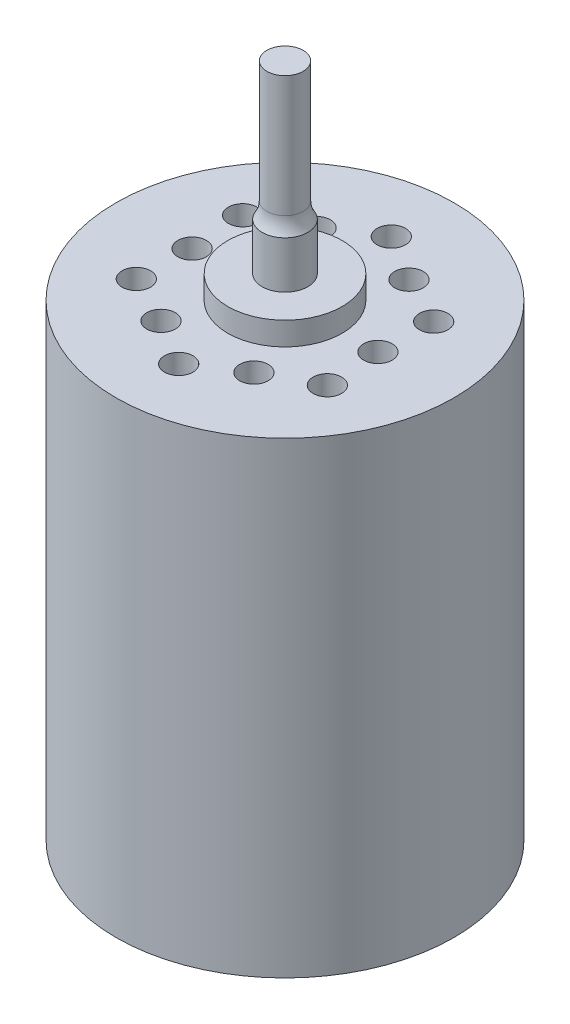
ISO-10303-21;
HEADER;
FILE_DESCRIPTION(('STEP AP214'),'2;1');
FILE_NAME('part.step','',(''),(''),'','','');
FILE_SCHEMA(('AUTOMOTIVE_DESIGN { 1 0 10303 214 1 1 1 1 }'));
ENDSEC;
DATA;
#1=APPLICATION_CONTEXT('core data for automotive mechanical design processes');
#2=APPLICATION_PROTOCOL_DEFINITION('international standard','automotive_design',2000,#1);
#3=PRODUCT_CONTEXT('',#1,'mechanical');
#4=PRODUCT('Part','Part','',(#3));
#5=PRODUCT_RELATED_PRODUCT_CATEGORY('part','',(#4));
#6=PRODUCT_DEFINITION_FORMATION('','',#4);
#7=PRODUCT_DEFINITION_CONTEXT('part definition',#1,'design');
#8=PRODUCT_DEFINITION('design','',#6,#7);
#9=PRODUCT_DEFINITION_SHAPE('','',#8);
#10=(LENGTH_UNIT() NAMED_UNIT(*) SI_UNIT(.MILLI.,.METRE.));
#11=(NAMED_UNIT(*) PLANE_ANGLE_UNIT() SI_UNIT($,.RADIAN.));
#12=(NAMED_UNIT(*) SI_UNIT($,.STERADIAN.) SOLID_ANGLE_UNIT());
#13=UNCERTAINTY_MEASURE_WITH_UNIT(LENGTH_MEASURE(1.E-05),#10,'distance_accuracy_value','');
#14=(GEOMETRIC_REPRESENTATION_CONTEXT(3) GLOBAL_UNCERTAINTY_ASSIGNED_CONTEXT((#13)) GLOBAL_UNIT_ASSIGNED_CONTEXT((#10,
#11,#12)) REPRESENTATION_CONTEXT('',''));
#15=CARTESIAN_POINT('',(0.,0.,0.));
#16=DIRECTION('',(0.,0.,1.));
#17=DIRECTION('',(1.,0.,0.));
#18=AXIS2_PLACEMENT_3D('',#15,#16,#17);
#19=CARTESIAN_POINT('',(0.,43.0276,0.));
#20=DIRECTION('',(0.,1.,0.));
#21=DIRECTION('',(0.,0.,1.));
#22=AXIS2_PLACEMENT_3D('',#19,#20,#21);
#23=PLANE('',#22);
#24=CARTESIAN_POINT('',(0.,43.0276,0.));
#25=DIRECTION('',(0.,1.,0.));
#26=DIRECTION('',(0.,0.,1.));
#27=AXIS2_PLACEMENT_3D('',#24,#25,#26);
#28=CIRCLE('',#27,5.0165);
#29=CARTESIAN_POINT('',(0.,43.0276,5.0165));
#30=VERTEX_POINT('',#29);
#31=EDGE_CURVE('E49',#30,#30,#28,.T.);
#32=ORIENTED_EDGE('',*,*,#31,.T.);
#33=EDGE_LOOP('',(#32));
#34=FACE_BOUND('',#33,.T.);
#35=CARTESIAN_POINT('',(0.,43.0276,0.));
#36=DIRECTION('',(0.,1.,0.));
#37=DIRECTION('',(0.,0.,1.));
#38=AXIS2_PLACEMENT_3D('',#35,#36,#37);
#39=CIRCLE('',#38,2.0066);
#40=CARTESIAN_POINT('',(0.,43.0276,2.0066));
#41=VERTEX_POINT('',#40);
#42=EDGE_CURVE('E57',#41,#41,#39,.T.);
#43=ORIENTED_EDGE('',*,*,#42,.F.);
#44=EDGE_LOOP('',(#43));
#45=FACE_BOUND('',#44,.T.);
#46=ADVANCED_FACE('F33',(#34,#45),#23,.T.);
#47=CARTESIAN_POINT('',(0.,40.9956,0.));
#48=DIRECTION('',(0.,1.,0.));
#49=DIRECTION('',(0.,0.,1.));
#50=AXIS2_PLACEMENT_3D('',#47,#48,#49);
#51=PLANE('',#50);
#52=CARTESIAN_POINT('',(4.1272177151194,40.9956,6.85317984092091));
#53=DIRECTION('',(0.,1.,0.));
#54=DIRECTION('',(0.,0.,1.));
#55=AXIS2_PLACEMENT_3D('',#52,#53,#54);
#56=CIRCLE('',#55,1.25);
#57=CARTESIAN_POINT('',(4.1272177151194,40.9956,8.10317984092091));
#58=VERTEX_POINT('',#57);
#59=EDGE_CURVE('E98',#58,#58,#56,.T.);
#60=ORIENTED_EDGE('',*,*,#59,.F.);
#61=EDGE_LOOP('',(#60));
#62=FACE_BOUND('',#61,.T.);
#63=CARTESIAN_POINT('',(-8.31352755408481,40.9956,-4.59731004039021));
#64=DIRECTION('',(0.,1.,0.));
#65=DIRECTION('',(0.,0.,1.));
#66=AXIS2_PLACEMENT_3D('',#63,#64,#65);
#67=CIRCLE('',#66,1.25);
#68=CARTESIAN_POINT('',(-8.31352755408481,40.9956,-3.34731004039021));
#69=VERTEX_POINT('',#68);
#70=EDGE_CURVE('E95',#69,#69,#67,.T.);
#71=ORIENTED_EDGE('',*,*,#70,.F.);
#72=EDGE_LOOP('',(#71));
#73=FACE_BOUND('',#72,.T.);
#74=CARTESIAN_POINT('',(-4.12721771511939,40.9956,-6.8531798409209));
#75=DIRECTION('',(0.,1.,0.));
#76=DIRECTION('',(0.,0.,1.));
#77=AXIS2_PLACEMENT_3D('',#74,#75,#76);
#78=CIRCLE('',#77,1.25);
#79=CARTESIAN_POINT('',(-4.12721771511939,40.9956,-5.6031798409209));
#80=VERTEX_POINT('',#79);
#81=EDGE_CURVE('E92',#80,#80,#78,.T.);
#82=ORIENTED_EDGE('',*,*,#81,.F.);
#83=EDGE_LOOP('',(#82));
#84=FACE_BOUND('',#83,.T.);
#85=CARTESIAN_POINT('',(-7.9986366965006,40.9956,0.147685467782111));
#86=DIRECTION('',(0.,1.,0.));
#87=DIRECTION('',(0.,0.,1.));
#88=AXIS2_PLACEMENT_3D('',#85,#86,#87);
#89=CIRCLE('',#88,1.25);
#90=CARTESIAN_POINT('',(-7.9986366965006,40.9956,1.39768546778211));
#91=VERTEX_POINT('',#90);
#92=EDGE_CURVE('E89',#91,#91,#89,.T.);
#93=ORIENTED_EDGE('',*,*,#92,.F.);
#94=EDGE_LOOP('',(#93));
#95=FACE_BOUND('',#94,.T.);
#96=CARTESIAN_POINT('',(-8.13815106109359,40.9956,4.90107103670425));
#97=DIRECTION('',(0.,1.,0.));
#98=DIRECTION('',(0.,0.,1.));
#99=AXIS2_PLACEMENT_3D('',#96,#97,#98);
#100=CIRCLE('',#99,1.25);
#101=CARTESIAN_POINT('',(-8.13815106109359,40.9956,6.15107103670425));
#102=VERTEX_POINT('',#101);
#103=EDGE_CURVE('E86',#102,#102,#100,.T.);
#104=ORIENTED_EDGE('',*,*,#103,.F.);
#105=EDGE_LOOP('',(#104));
#106=FACE_BOUND('',#105,.T.);
#107=CARTESIAN_POINT('',(-3.8714189813812,40.9956,7.00086530870301));
#108=DIRECTION('',(0.,1.,0.));
#109=DIRECTION('',(0.,0.,1.));
#110=AXIS2_PLACEMENT_3D('',#107,#108,#109);
#111=CIRCLE('',#110,1.25);
#112=CARTESIAN_POINT('',(-3.8714189813812,40.9956,8.25086530870301));
#113=VERTEX_POINT('',#112);
#114=EDGE_CURVE('E83',#113,#113,#111,.T.);
#115=ORIENTED_EDGE('',*,*,#114,.F.);
#116=EDGE_LOOP('',(#115));
#117=FACE_BOUND('',#116,.T.);
#118=CARTESIAN_POINT('',(0.175376492991219,40.9956,9.49838107709446));
#119=DIRECTION('',(0.,1.,0.));
#120=DIRECTION('',(0.,0.,1.));
#121=AXIS2_PLACEMENT_3D('',#118,#119,#120);
#122=CIRCLE('',#121,1.25);
#123=CARTESIAN_POINT('',(0.175376492991219,40.9956,10.7483810770945));
#124=VERTEX_POINT('',#123);
#125=EDGE_CURVE('E80',#124,#124,#122,.T.);
#126=ORIENTED_EDGE('',*,*,#125,.F.);
#127=EDGE_LOOP('',(#126));
#128=FACE_BOUND('',#127,.T.);
#129=CARTESIAN_POINT('',(8.31352755408481,40.9956,4.59731004039021));
#130=DIRECTION('',(0.,1.,0.));
#131=DIRECTION('',(0.,0.,1.));
#132=AXIS2_PLACEMENT_3D('',#129,#130,#131);
#133=CIRCLE('',#132,1.25);
#134=CARTESIAN_POINT('',(8.31352755408481,40.9956,5.84731004039021));
#135=VERTEX_POINT('',#134);
#136=EDGE_CURVE('E77',#135,#135,#133,.T.);
#137=ORIENTED_EDGE('',*,*,#136,.F.);
#138=EDGE_LOOP('',(#137));
#139=FACE_BOUND('',#138,.T.);
#140=CARTESIAN_POINT('',(7.9986366965006,40.9956,-0.147685467782108));
#141=DIRECTION('',(0.,1.,0.));
#142=DIRECTION('',(0.,0.,1.));
#143=AXIS2_PLACEMENT_3D('',#140,#141,#142);
#144=CIRCLE('',#143,1.25);
#145=CARTESIAN_POINT('',(7.9986366965006,40.9956,1.10231453221789));
#146=VERTEX_POINT('',#145);
#147=EDGE_CURVE('E74',#146,#146,#144,.T.);
#148=ORIENTED_EDGE('',*,*,#147,.F.);
#149=EDGE_LOOP('',(#148));
#150=FACE_BOUND('',#149,.T.);
#151=CARTESIAN_POINT('',(8.13815106109359,40.9956,-4.90107103670425));
#152=DIRECTION('',(0.,1.,0.));
#153=DIRECTION('',(0.,0.,1.));
#154=AXIS2_PLACEMENT_3D('',#151,#152,#153);
#155=CIRCLE('',#154,1.25);
#156=CARTESIAN_POINT('',(8.13815106109359,40.9956,-3.65107103670425));
#157=VERTEX_POINT('',#156);
#158=EDGE_CURVE('E71',#157,#157,#155,.T.);
#159=ORIENTED_EDGE('',*,*,#158,.F.);
#160=EDGE_LOOP('',(#159));
#161=FACE_BOUND('',#160,.T.);
#162=CARTESIAN_POINT('',(3.8714189813812,40.9956,-7.00086530870301));
#163=DIRECTION('',(0.,1.,0.));
#164=DIRECTION('',(0.,0.,1.));
#165=AXIS2_PLACEMENT_3D('',#162,#163,#164);
#166=CIRCLE('',#165,1.25);
#167=CARTESIAN_POINT('',(3.8714189813812,40.9956,-5.75086530870302));
#168=VERTEX_POINT('',#167);
#169=EDGE_CURVE('E68',#168,#168,#166,.T.);
#170=ORIENTED_EDGE('',*,*,#169,.F.);
#171=EDGE_LOOP('',(#170));
#172=FACE_BOUND('',#171,.T.);
#173=CARTESIAN_POINT('',(-0.175376492991219,40.9956,-9.49838107709446));
#174=DIRECTION('',(0.,1.,0.));
#175=DIRECTION('',(0.,0.,1.));
#176=AXIS2_PLACEMENT_3D('',#173,#174,#175);
#177=CIRCLE('',#176,1.25);
#178=CARTESIAN_POINT('',(-0.175376492991219,40.9956,-8.24838107709446));
#179=VERTEX_POINT('',#178);
#180=EDGE_CURVE('E65',#179,#179,#177,.T.);
#181=ORIENTED_EDGE('',*,*,#180,.F.);
#182=EDGE_LOOP('',(#181));
#183=FACE_BOUND('',#182,.T.);
#184=CARTESIAN_POINT('',(0.,40.9956,0.));
#185=DIRECTION('',(0.,1.,0.));
#186=DIRECTION('',(0.,0.,1.));
#187=AXIS2_PLACEMENT_3D('',#184,#185,#186);
#188=CIRCLE('',#187,14.8209);
#189=CARTESIAN_POINT('',(0.,40.9956,14.8209));
#190=VERTEX_POINT('',#189);
#191=EDGE_CURVE('E40',#190,#190,#188,.T.);
#192=ORIENTED_EDGE('',*,*,#191,.T.);
#193=EDGE_LOOP('',(#192));
#194=FACE_BOUND('',#193,.T.);
#195=CARTESIAN_POINT('',(0.,40.9956,0.));
#196=DIRECTION('',(0.,1.,0.));
#197=DIRECTION('',(0.,0.,1.));
#198=AXIS2_PLACEMENT_3D('',#195,#196,#197);
#199=CIRCLE('',#198,5.0165);
#200=CARTESIAN_POINT('',(0.,40.9956,5.0165));
#201=VERTEX_POINT('',#200);
#202=EDGE_CURVE('E51',#201,#201,#199,.T.);
#203=ORIENTED_EDGE('',*,*,#202,.F.);
#204=EDGE_LOOP('',(#203));
#205=FACE_BOUND('',#204,.T.);
#206=ADVANCED_FACE('F177',(#62,#73,#84,#95,#106,#117,#128,#139,#150,#161,#172,#183,#194,#205),
#51,.T.);
#207=CARTESIAN_POINT('',(0.,40.9956,0.));
#208=DIRECTION('',(0.,-1.,0.));
#209=DIRECTION('',(0.,0.,-1.));
#210=AXIS2_PLACEMENT_3D('',#207,#208,#209);
#211=CYLINDRICAL_SURFACE('',#210,14.8209);
#212=ORIENTED_EDGE('',*,*,#191,.F.);
#213=EDGE_LOOP('',(#212));
#214=FACE_BOUND('',#213,.T.);
#215=CARTESIAN_POINT('',(0.,0.,0.));
#216=DIRECTION('',(0.,1.,0.));
#217=DIRECTION('',(0.,0.,1.));
#218=AXIS2_PLACEMENT_3D('',#215,#216,#217);
#219=CIRCLE('',#218,14.8209);
#220=CARTESIAN_POINT('',(0.,0.,14.8209));
#221=VERTEX_POINT('',#220);
#222=EDGE_CURVE('E44',#221,#221,#219,.T.);
#223=ORIENTED_EDGE('',*,*,#222,.T.);
#224=EDGE_LOOP('',(#223));
#225=FACE_BOUND('',#224,.T.);
#226=ADVANCED_FACE('F179',(#214,#225),#211,.T.);
#227=CARTESIAN_POINT('',(0.,0.,0.));
#228=DIRECTION('',(0.,1.,0.));
#229=DIRECTION('',(0.,0.,1.));
#230=AXIS2_PLACEMENT_3D('',#227,#228,#229);
#231=PLANE('',#230);
#232=ORIENTED_EDGE('',*,*,#222,.F.);
#233=EDGE_LOOP('',(#232));
#234=FACE_BOUND('',#233,.T.);
#235=ADVANCED_FACE('F188',(#234),#231,.F.);
#236=CARTESIAN_POINT('',(0.,43.0276,0.));
#237=DIRECTION('',(0.,-1.,0.));
#238=DIRECTION('',(0.,0.,-1.));
#239=AXIS2_PLACEMENT_3D('',#236,#237,#238);
#240=CYLINDRICAL_SURFACE('',#239,5.0165);
#241=ORIENTED_EDGE('',*,*,#31,.F.);
#242=EDGE_LOOP('',(#241));
#243=FACE_BOUND('',#242,.T.);
#244=ORIENTED_EDGE('',*,*,#202,.T.);
#245=EDGE_LOOP('',(#244));
#246=FACE_BOUND('',#245,.T.);
#247=ADVANCED_FACE('F185',(#243,#246),#240,.T.);
#248=CARTESIAN_POINT('',(0.,47.1551,0.));
#249=DIRECTION('',(0.,-1.,0.));
#250=DIRECTION('',(0.,0.,-1.));
#251=AXIS2_PLACEMENT_3D('',#248,#249,#250);
#252=CYLINDRICAL_SURFACE('',#251,2.0066);
#253=CARTESIAN_POINT('',(0.,47.1551,0.));
#254=DIRECTION('',(0.,1.,0.));
#255=DIRECTION('',(0.,0.,1.));
#256=AXIS2_PLACEMENT_3D('',#253,#254,#255);
#257=CIRCLE('',#256,2.0066);
#258=CARTESIAN_POINT('',(0.,47.1551,2.0066));
#259=VERTEX_POINT('',#258);
#260=EDGE_CURVE('E54',#259,#259,#257,.T.);
#261=ORIENTED_EDGE('',*,*,#260,.F.);
#262=EDGE_LOOP('',(#261));
#263=FACE_BOUND('',#262,.T.);
#264=ORIENTED_EDGE('',*,*,#42,.T.);
#265=EDGE_LOOP('',(#264));
#266=FACE_BOUND('',#265,.T.);
#267=ADVANCED_FACE('F187',(#263,#266),#252,.T.);
#268=CARTESIAN_POINT('',(0.,59.182,0.));
#269=DIRECTION('',(0.,-1.,0.));
#270=DIRECTION('',(0.,0.,-1.));
#271=AXIS2_PLACEMENT_3D('',#268,#269,#270);
#272=CYLINDRICAL_SURFACE('',#271,1.59385);
#273=CARTESIAN_POINT('',(0.,48.543050805144,0.));
#274=DIRECTION('',(0.,-1.,0.));
#275=DIRECTION('',(0.,0.,-1.));
#276=AXIS2_PLACEMENT_3D('',#273,#274,#275);
#277=CIRCLE('',#276,1.59385);
#278=CARTESIAN_POINT('',(0.,48.543050805144,-1.59385));
#279=VERTEX_POINT('',#278);
#280=EDGE_CURVE('E10',#279,#279,#277,.F.);
#281=CARTESIAN_POINT('',(0.,59.182,0.));
#282=DIRECTION('',(0.,1.,0.));
#283=DIRECTION('',(0.,0.,1.));
#284=AXIS2_PLACEMENT_3D('',#281,#282,#283);
#285=CIRCLE('',#284,1.59385);
#286=CARTESIAN_POINT('',(0.,59.182,-1.59385));
#287=VERTEX_POINT('',#286);
#288=EDGE_CURVE('E60',#287,#287,#285,.T.);
#289=CARTESIAN_POINT('',(0.,48.543050805144,-1.59385));
#290=CARTESIAN_POINT('',(0.,48.6538731925905,-1.59385));
#291=CARTESIAN_POINT('',(0.,48.7646955800369,-1.59385));
#292=CARTESIAN_POINT('',(0.,48.9863403549297,-1.59385));
#293=CARTESIAN_POINT('',(0.,49.0971627423761,-1.59385));
#294=CARTESIAN_POINT('',(0.,49.318807517269,-1.59385));
#295=CARTESIAN_POINT('',(0.,49.4296299047154,-1.59385));
#296=CARTESIAN_POINT('',(0.,49.6512746796082,-1.59385));
#297=CARTESIAN_POINT('',(0.,49.7620970670546,-1.59385));
#298=CARTESIAN_POINT('',(0.,49.9837418419475,-1.59385));
#299=CARTESIAN_POINT('',(0.,50.0945642293939,-1.59385));
#300=CARTESIAN_POINT('',(0.,50.3162090042867,-1.59385));
#301=CARTESIAN_POINT('',(0.,50.4270313917331,-1.59385));
#302=CARTESIAN_POINT('',(0.,50.648676166626,-1.59385));
#303=CARTESIAN_POINT('',(0.,50.7594985540724,-1.59385));
#304=CARTESIAN_POINT('',(0.,50.9811433289652,-1.59385));
#305=CARTESIAN_POINT('',(0.,51.0919657164116,-1.59385));
#306=CARTESIAN_POINT('',(0.,51.3136104913045,-1.59385));
#307=CARTESIAN_POINT('',(0.,51.4244328787509,-1.59385));
#308=CARTESIAN_POINT('',(0.,51.6460776536437,-1.59385));
#309=CARTESIAN_POINT('',(0.,51.7569000410901,-1.59385));
#310=CARTESIAN_POINT('',(0.,51.9785448159829,-1.59385));
#311=CARTESIAN_POINT('',(0.,52.0893672034294,-1.59385));
#312=CARTESIAN_POINT('',(0.,52.3110119783222,-1.59385));
#313=CARTESIAN_POINT('',(0.,52.4218343657686,-1.59385));
#314=CARTESIAN_POINT('',(0.,52.6434791406614,-1.59385));
#315=CARTESIAN_POINT('',(0.,52.7543015281079,-1.59385));
#316=CARTESIAN_POINT('',(0.,52.9759463030007,-1.59385));
#317=CARTESIAN_POINT('',(0.,53.0867686904471,-1.59385));
#318=CARTESIAN_POINT('',(0.,53.3084134653399,-1.59385));
#319=CARTESIAN_POINT('',(0.,53.4192358527864,-1.59385));
#320=CARTESIAN_POINT('',(0.,53.6408806276792,-1.59385));
#321=CARTESIAN_POINT('',(0.,53.7517030151256,-1.59385));
#322=CARTESIAN_POINT('',(0.,53.9733477900184,-1.59385));
#323=CARTESIAN_POINT('',(0.,54.0841701774648,-1.59385));
#324=CARTESIAN_POINT('',(0.,54.3058149523577,-1.59385));
#325=CARTESIAN_POINT('',(0.,54.4166373398041,-1.59385));
#326=CARTESIAN_POINT('',(0.,54.6382821146969,-1.59385));
#327=CARTESIAN_POINT('',(0.,54.7491045021433,-1.59385));
#328=CARTESIAN_POINT('',(0.,54.9707492770362,-1.59385));
#329=CARTESIAN_POINT('',(0.,55.0815716644826,-1.59385));
#330=CARTESIAN_POINT('',(0.,55.3032164393754,-1.59385));
#331=CARTESIAN_POINT('',(0.,55.4140388268218,-1.59385));
#332=CARTESIAN_POINT('',(0.,55.6356836017147,-1.59385));
#333=CARTESIAN_POINT('',(0.,55.7465059891611,-1.59385));
#334=CARTESIAN_POINT('',(0.,55.9681507640539,-1.59385));
#335=CARTESIAN_POINT('',(0.,56.0789731515003,-1.59385));
#336=CARTESIAN_POINT('',(0.,56.3006179263932,-1.59385));
#337=CARTESIAN_POINT('',(0.,56.4114403138396,-1.59385));
#338=CARTESIAN_POINT('',(0.,56.6330850887324,-1.59385));
#339=CARTESIAN_POINT('',(0.,56.7439074761788,-1.59385));
#340=CARTESIAN_POINT('',(0.,56.9655522510717,-1.59385));
#341=CARTESIAN_POINT('',(0.,57.0763746385181,-1.59385));
#342=CARTESIAN_POINT('',(0.,57.2980194134109,-1.59385));
#343=CARTESIAN_POINT('',(0.,57.4088418008573,-1.59385));
#344=CARTESIAN_POINT('',(0.,57.6304865757502,-1.59385));
#345=CARTESIAN_POINT('',(0.,57.7413089631966,-1.59385));
#346=CARTESIAN_POINT('',(0.,57.9629537380894,-1.59385));
#347=CARTESIAN_POINT('',(0.,58.0737761255358,-1.59385));
#348=CARTESIAN_POINT('',(0.,58.2954209004287,-1.59385));
#349=CARTESIAN_POINT('',(0.,58.4062432878751,-1.59385));
#350=CARTESIAN_POINT('',(0.,58.6278880627679,-1.59385));
#351=CARTESIAN_POINT('',(0.,58.7387104502143,-1.59385));
#352=CARTESIAN_POINT('',(0.,58.9603552251072,-1.59385));
#353=CARTESIAN_POINT('',(0.,59.0711776125536,-1.59385));
#354=CARTESIAN_POINT('',(0.,59.182,-1.59385));
#355=B_SPLINE_CURVE_WITH_KNOTS('',3,(#289,#290,#291,#292,#293,#294,#295,#296,#297,#298,#299,
#300,#301,#302,#303,#304,#305,#306,#307,#308,#309,#310,#311,#312,#313,#314,#315,#316,#317,#318,
#319,#320,#321,#322,#323,#324,#325,#326,#327,#328,#329,#330,#331,#332,#333,#334,#335,#336,#337,
#338,#339,#340,#341,#342,#343,#344,#345,#346,#347,#348,#349,#350,#351,#352,#353,#354),
.UNSPECIFIED.,.F.,.F.,(4,2,2,2,2,2,2,2,2,2,2,2,2,2,2,2,2,2,2,2,2,2,2,2,2,2,2,2,2,2,2,2,4),(0.,
0.332467162339249,0.664934324678491,0.997401487017747,1.32986864935699,1.66233581169624,
1.99480297403549,2.32727013637474,2.65973729871399,2.99220446105324,3.32467162339248,
3.65713878573173,3.98960594807098,4.32207311041023,4.65454027274947,4.98700743508872,
5.31947459742797,5.65194175976722,5.98440892210647,6.31687608444572,6.64934324678497,
6.98181040912422,7.31427757146347,7.64674473380271,7.97921189614196,8.31167905848121,
8.64414622082046,8.97661338315971,9.30908054549896,9.64154770783821,9.97401487017745,
10.3064820325167,10.638949194856),.UNSPECIFIED.);
#356=EDGE_CURVE('BSEAM195',#279,#287,#355,.T.);
#357=ORIENTED_EDGE('',*,*,#280,.T.);
#358=ORIENTED_EDGE('',*,*,#288,.F.);
#359=ORIENTED_EDGE('',*,*,#356,.T.);
#360=ORIENTED_EDGE('',*,*,#356,.F.);
#361=EDGE_LOOP('',(#357,#359,#358,#360));
#362=FACE_BOUND('',#361,.T.);
#363=ADVANCED_FACE('F195',(#362),#272,.T.);
#364=CARTESIAN_POINT('',(0.,59.182,0.));
#365=DIRECTION('',(0.,1.,0.));
#366=DIRECTION('',(0.,0.,1.));
#367=AXIS2_PLACEMENT_3D('',#364,#365,#366);
#368=PLANE('',#367);
#369=ORIENTED_EDGE('',*,*,#288,.T.);
#370=EDGE_LOOP('',(#369));
#371=FACE_BOUND('',#370,.T.);
#372=ADVANCED_FACE('F210',(#371),#368,.T.);
#373=CARTESIAN_POINT('',(0.,48.543050805144,0.));
#374=DIRECTION('',(0.,-1.,0.));
#375=DIRECTION('',(0.,0.,-1.));
#376=AXIS2_PLACEMENT_3D('',#373,#374,#375);
#377=TOROIDAL_SURFACE('',#376,4.13385,2.54);
#378=ORIENTED_EDGE('',*,*,#260,.T.);
#379=EDGE_LOOP('',(#378));
#380=FACE_BOUND('',#379,.T.);
#381=ORIENTED_EDGE('',*,*,#280,.F.);
#382=EDGE_LOOP('',(#381));
#383=FACE_BOUND('',#382,.T.);
#384=ADVANCED_FACE('F35',(#380,#383),#377,.F.);
#385=CARTESIAN_POINT('',(-0.175376492991219,37.8206,-9.49838107709446));
#386=DIRECTION('',(0.,1.,0.));
#387=DIRECTION('',(0.,0.,1.));
#388=AXIS2_PLACEMENT_3D('',#385,#386,#387);
#389=CYLINDRICAL_SURFACE('',#388,1.25);
#390=CARTESIAN_POINT('',(-0.175376492991219,37.8206,-9.49838107709446));
#391=DIRECTION('',(0.,1.,0.));
#392=DIRECTION('',(0.,0.,1.));
#393=AXIS2_PLACEMENT_3D('',#390,#391,#392);
#394=CIRCLE('',#393,1.25);
#395=CARTESIAN_POINT('',(-0.175376492991219,37.8206,-8.24838107709446));
#396=VERTEX_POINT('',#395);
#397=EDGE_CURVE('E101',#396,#396,#394,.F.);
#398=ORIENTED_EDGE('',*,*,#397,.T.);
#399=EDGE_LOOP('',(#398));
#400=FACE_BOUND('',#399,.T.);
#401=ORIENTED_EDGE('',*,*,#180,.T.);
#402=EDGE_LOOP('',(#401));
#403=FACE_BOUND('',#402,.T.);
#404=ADVANCED_FACE('F170',(#400,#403),#389,.F.);
#405=CARTESIAN_POINT('',(3.8714189813812,37.8206,-7.00086530870301));
#406=DIRECTION('',(0.,1.,0.));
#407=DIRECTION('',(0.,0.,1.));
#408=AXIS2_PLACEMENT_3D('',#405,#406,#407);
#409=CYLINDRICAL_SURFACE('',#408,1.25);
#410=CARTESIAN_POINT('',(3.8714189813812,37.8206,-7.00086530870301));
#411=DIRECTION('',(0.,1.,0.));
#412=DIRECTION('',(0.,0.,1.));
#413=AXIS2_PLACEMENT_3D('',#410,#411,#412);
#414=CIRCLE('',#413,1.25);
#415=CARTESIAN_POINT('',(3.8714189813812,37.8206,-5.75086530870302));
#416=VERTEX_POINT('',#415);
#417=EDGE_CURVE('E104',#416,#416,#414,.F.);
#418=ORIENTED_EDGE('',*,*,#417,.T.);
#419=EDGE_LOOP('',(#418));
#420=FACE_BOUND('',#419,.T.);
#421=ORIENTED_EDGE('',*,*,#169,.T.);
#422=EDGE_LOOP('',(#421));
#423=FACE_BOUND('',#422,.T.);
#424=ADVANCED_FACE('F173',(#420,#423),#409,.F.);
#425=CARTESIAN_POINT('',(8.13815106109359,37.8206,-4.90107103670425));
#426=DIRECTION('',(0.,1.,0.));
#427=DIRECTION('',(0.,0.,1.));
#428=AXIS2_PLACEMENT_3D('',#425,#426,#427);
#429=CYLINDRICAL_SURFACE('',#428,1.25);
#430=CARTESIAN_POINT('',(8.13815106109359,37.8206,-4.90107103670425));
#431=DIRECTION('',(0.,1.,0.));
#432=DIRECTION('',(0.,0.,1.));
#433=AXIS2_PLACEMENT_3D('',#430,#431,#432);
#434=CIRCLE('',#433,1.25);
#435=CARTESIAN_POINT('',(8.13815106109359,37.8206,-3.65107103670425));
#436=VERTEX_POINT('',#435);
#437=EDGE_CURVE('E107',#436,#436,#434,.F.);
#438=ORIENTED_EDGE('',*,*,#437,.T.);
#439=EDGE_LOOP('',(#438));
#440=FACE_BOUND('',#439,.T.);
#441=ORIENTED_EDGE('',*,*,#158,.T.);
#442=EDGE_LOOP('',(#441));
#443=FACE_BOUND('',#442,.T.);
#444=ADVANCED_FACE('F216',(#440,#443),#429,.F.);
#445=CARTESIAN_POINT('',(7.9986366965006,37.8206,-0.147685467782108));
#446=DIRECTION('',(0.,1.,0.));
#447=DIRECTION('',(0.,0.,1.));
#448=AXIS2_PLACEMENT_3D('',#445,#446,#447);
#449=CYLINDRICAL_SURFACE('',#448,1.25);
#450=CARTESIAN_POINT('',(7.9986366965006,37.8206,-0.147685467782108));
#451=DIRECTION('',(0.,1.,0.));
#452=DIRECTION('',(0.,0.,1.));
#453=AXIS2_PLACEMENT_3D('',#450,#451,#452);
#454=CIRCLE('',#453,1.25);
#455=CARTESIAN_POINT('',(7.9986366965006,37.8206,1.10231453221789));
#456=VERTEX_POINT('',#455);
#457=EDGE_CURVE('E110',#456,#456,#454,.F.);
#458=ORIENTED_EDGE('',*,*,#457,.T.);
#459=EDGE_LOOP('',(#458));
#460=FACE_BOUND('',#459,.T.);
#461=ORIENTED_EDGE('',*,*,#147,.T.);
#462=EDGE_LOOP('',(#461));
#463=FACE_BOUND('',#462,.T.);
#464=ADVANCED_FACE('F220',(#460,#463),#449,.F.);
#465=CARTESIAN_POINT('',(8.31352755408481,37.8206,4.59731004039021));
#466=DIRECTION('',(0.,1.,0.));
#467=DIRECTION('',(0.,0.,1.));
#468=AXIS2_PLACEMENT_3D('',#465,#466,#467);
#469=CYLINDRICAL_SURFACE('',#468,1.25);
#470=CARTESIAN_POINT('',(8.31352755408481,37.8206,4.59731004039021));
#471=DIRECTION('',(0.,1.,0.));
#472=DIRECTION('',(0.,0.,1.));
#473=AXIS2_PLACEMENT_3D('',#470,#471,#472);
#474=CIRCLE('',#473,1.25);
#475=CARTESIAN_POINT('',(8.31352755408481,37.8206,5.84731004039021));
#476=VERTEX_POINT('',#475);
#477=EDGE_CURVE('E113',#476,#476,#474,.F.);
#478=ORIENTED_EDGE('',*,*,#477,.T.);
#479=EDGE_LOOP('',(#478));
#480=FACE_BOUND('',#479,.T.);
#481=ORIENTED_EDGE('',*,*,#136,.T.);
#482=EDGE_LOOP('',(#481));
#483=FACE_BOUND('',#482,.T.);
#484=ADVANCED_FACE('F224',(#480,#483),#469,.F.);
#485=CARTESIAN_POINT('',(0.175376492991219,37.8206,9.49838107709446));
#486=DIRECTION('',(0.,1.,0.));
#487=DIRECTION('',(0.,0.,1.));
#488=AXIS2_PLACEMENT_3D('',#485,#486,#487);
#489=CYLINDRICAL_SURFACE('',#488,1.25);
#490=CARTESIAN_POINT('',(0.175376492991219,37.8206,9.49838107709446));
#491=DIRECTION('',(0.,1.,0.));
#492=DIRECTION('',(0.,0.,1.));
#493=AXIS2_PLACEMENT_3D('',#490,#491,#492);
#494=CIRCLE('',#493,1.25);
#495=CARTESIAN_POINT('',(0.175376492991219,37.8206,10.7483810770945));
#496=VERTEX_POINT('',#495);
#497=EDGE_CURVE('E116',#496,#496,#494,.F.);
#498=ORIENTED_EDGE('',*,*,#497,.T.);
#499=EDGE_LOOP('',(#498));
#500=FACE_BOUND('',#499,.T.);
#501=ORIENTED_EDGE('',*,*,#125,.T.);
#502=EDGE_LOOP('',(#501));
#503=FACE_BOUND('',#502,.T.);
#504=ADVANCED_FACE('F228',(#500,#503),#489,.F.);
#505=CARTESIAN_POINT('',(-3.8714189813812,37.8206,7.00086530870301));
#506=DIRECTION('',(0.,1.,0.));
#507=DIRECTION('',(0.,0.,1.));
#508=AXIS2_PLACEMENT_3D('',#505,#506,#507);
#509=CYLINDRICAL_SURFACE('',#508,1.25);
#510=CARTESIAN_POINT('',(-3.8714189813812,37.8206,7.00086530870301));
#511=DIRECTION('',(0.,1.,0.));
#512=DIRECTION('',(0.,0.,1.));
#513=AXIS2_PLACEMENT_3D('',#510,#511,#512);
#514=CIRCLE('',#513,1.25);
#515=CARTESIAN_POINT('',(-3.8714189813812,37.8206,8.25086530870301));
#516=VERTEX_POINT('',#515);
#517=EDGE_CURVE('E119',#516,#516,#514,.F.);
#518=ORIENTED_EDGE('',*,*,#517,.T.);
#519=EDGE_LOOP('',(#518));
#520=FACE_BOUND('',#519,.T.);
#521=ORIENTED_EDGE('',*,*,#114,.T.);
#522=EDGE_LOOP('',(#521));
#523=FACE_BOUND('',#522,.T.);
#524=ADVANCED_FACE('F232',(#520,#523),#509,.F.);
#525=CARTESIAN_POINT('',(-8.13815106109359,37.8206,4.90107103670425));
#526=DIRECTION('',(0.,1.,0.));
#527=DIRECTION('',(0.,0.,1.));
#528=AXIS2_PLACEMENT_3D('',#525,#526,#527);
#529=CYLINDRICAL_SURFACE('',#528,1.25);
#530=CARTESIAN_POINT('',(-8.13815106109359,37.8206,4.90107103670425));
#531=DIRECTION('',(0.,1.,0.));
#532=DIRECTION('',(0.,0.,1.));
#533=AXIS2_PLACEMENT_3D('',#530,#531,#532);
#534=CIRCLE('',#533,1.25);
#535=CARTESIAN_POINT('',(-8.13815106109359,37.8206,6.15107103670425));
#536=VERTEX_POINT('',#535);
#537=EDGE_CURVE('E122',#536,#536,#534,.F.);
#538=ORIENTED_EDGE('',*,*,#537,.T.);
#539=EDGE_LOOP('',(#538));
#540=FACE_BOUND('',#539,.T.);
#541=ORIENTED_EDGE('',*,*,#103,.T.);
#542=EDGE_LOOP('',(#541));
#543=FACE_BOUND('',#542,.T.);
#544=ADVANCED_FACE('F236',(#540,#543),#529,.F.);
#545=CARTESIAN_POINT('',(-7.9986366965006,37.8206,0.147685467782111));
#546=DIRECTION('',(0.,1.,0.));
#547=DIRECTION('',(0.,0.,1.));
#548=AXIS2_PLACEMENT_3D('',#545,#546,#547);
#549=CYLINDRICAL_SURFACE('',#548,1.25);
#550=CARTESIAN_POINT('',(-7.9986366965006,37.8206,0.147685467782111));
#551=DIRECTION('',(0.,1.,0.));
#552=DIRECTION('',(0.,0.,1.));
#553=AXIS2_PLACEMENT_3D('',#550,#551,#552);
#554=CIRCLE('',#553,1.25);
#555=CARTESIAN_POINT('',(-7.9986366965006,37.8206,1.39768546778211));
#556=VERTEX_POINT('',#555);
#557=EDGE_CURVE('E125',#556,#556,#554,.F.);
#558=ORIENTED_EDGE('',*,*,#557,.T.);
#559=EDGE_LOOP('',(#558));
#560=FACE_BOUND('',#559,.T.);
#561=ORIENTED_EDGE('',*,*,#92,.T.);
#562=EDGE_LOOP('',(#561));
#563=FACE_BOUND('',#562,.T.);
#564=ADVANCED_FACE('F240',(#560,#563),#549,.F.);
#565=CARTESIAN_POINT('',(-4.12721771511939,37.8206,-6.8531798409209));
#566=DIRECTION('',(0.,1.,0.));
#567=DIRECTION('',(0.,0.,1.));
#568=AXIS2_PLACEMENT_3D('',#565,#566,#567);
#569=CYLINDRICAL_SURFACE('',#568,1.25);
#570=CARTESIAN_POINT('',(-4.12721771511939,37.8206,-6.8531798409209));
#571=DIRECTION('',(0.,1.,0.));
#572=DIRECTION('',(0.,0.,1.));
#573=AXIS2_PLACEMENT_3D('',#570,#571,#572);
#574=CIRCLE('',#573,1.25);
#575=CARTESIAN_POINT('',(-4.12721771511939,37.8206,-5.6031798409209));
#576=VERTEX_POINT('',#575);
#577=EDGE_CURVE('E128',#576,#576,#574,.F.);
#578=ORIENTED_EDGE('',*,*,#577,.T.);
#579=EDGE_LOOP('',(#578));
#580=FACE_BOUND('',#579,.T.);
#581=ORIENTED_EDGE('',*,*,#81,.T.);
#582=EDGE_LOOP('',(#581));
#583=FACE_BOUND('',#582,.T.);
#584=ADVANCED_FACE('F244',(#580,#583),#569,.F.);
#585=CARTESIAN_POINT('',(-8.31352755408481,37.8206,-4.59731004039021));
#586=DIRECTION('',(0.,1.,0.));
#587=DIRECTION('',(0.,0.,1.));
#588=AXIS2_PLACEMENT_3D('',#585,#586,#587);
#589=CYLINDRICAL_SURFACE('',#588,1.25);
#590=CARTESIAN_POINT('',(-8.31352755408481,37.8206,-4.59731004039021));
#591=DIRECTION('',(0.,1.,0.));
#592=DIRECTION('',(0.,0.,1.));
#593=AXIS2_PLACEMENT_3D('',#590,#591,#592);
#594=CIRCLE('',#593,1.25);
#595=CARTESIAN_POINT('',(-8.31352755408481,37.8206,-3.34731004039021));
#596=VERTEX_POINT('',#595);
#597=EDGE_CURVE('E131',#596,#596,#594,.F.);
#598=ORIENTED_EDGE('',*,*,#597,.T.);
#599=EDGE_LOOP('',(#598));
#600=FACE_BOUND('',#599,.T.);
#601=ORIENTED_EDGE('',*,*,#70,.T.);
#602=EDGE_LOOP('',(#601));
#603=FACE_BOUND('',#602,.T.);
#604=ADVANCED_FACE('F248',(#600,#603),#589,.F.);
#605=CARTESIAN_POINT('',(4.1272177151194,37.8206,6.85317984092091));
#606=DIRECTION('',(0.,1.,0.));
#607=DIRECTION('',(0.,0.,1.));
#608=AXIS2_PLACEMENT_3D('',#605,#606,#607);
#609=CYLINDRICAL_SURFACE('',#608,1.25);
#610=CARTESIAN_POINT('',(4.1272177151194,37.8206,6.85317984092091));
#611=DIRECTION('',(0.,1.,0.));
#612=DIRECTION('',(0.,0.,1.));
#613=AXIS2_PLACEMENT_3D('',#610,#611,#612);
#614=CIRCLE('',#613,1.25);
#615=CARTESIAN_POINT('',(4.1272177151194,37.8206,8.10317984092091));
#616=VERTEX_POINT('',#615);
#617=EDGE_CURVE('E134',#616,#616,#614,.F.);
#618=ORIENTED_EDGE('',*,*,#617,.T.);
#619=EDGE_LOOP('',(#618));
#620=FACE_BOUND('',#619,.T.);
#621=ORIENTED_EDGE('',*,*,#59,.T.);
#622=EDGE_LOOP('',(#621));
#623=FACE_BOUND('',#622,.T.);
#624=ADVANCED_FACE('F155',(#620,#623),#609,.F.);
#625=CARTESIAN_POINT('',(0.,37.8206,0.));
#626=DIRECTION('',(0.,1.,0.));
#627=DIRECTION('',(0.,0.,1.));
#628=AXIS2_PLACEMENT_3D('',#625,#626,#627);
#629=PLANE('',#628);
#630=ORIENTED_EDGE('',*,*,#417,.F.);
#631=EDGE_LOOP('',(#630));
#632=FACE_BOUND('',#631,.T.);
#633=ORIENTED_EDGE('',*,*,#457,.F.);
#634=EDGE_LOOP('',(#633));
#635=FACE_BOUND('',#634,.T.);
#636=ORIENTED_EDGE('',*,*,#497,.F.);
#637=EDGE_LOOP('',(#636));
#638=FACE_BOUND('',#637,.T.);
#639=ORIENTED_EDGE('',*,*,#537,.F.);
#640=EDGE_LOOP('',(#639));
#641=FACE_BOUND('',#640,.T.);
#642=ORIENTED_EDGE('',*,*,#577,.F.);
#643=EDGE_LOOP('',(#642));
#644=FACE_BOUND('',#643,.T.);
#645=ORIENTED_EDGE('',*,*,#617,.F.);
#646=EDGE_LOOP('',(#645));
#647=FACE_BOUND('',#646,.T.);
#648=CARTESIAN_POINT('',(0.,37.8206,0.));
#649=DIRECTION('',(0.,1.,0.));
#650=DIRECTION('',(0.,0.,1.));
#651=AXIS2_PLACEMENT_3D('',#648,#649,#650);
#652=CIRCLE('',#651,14.4272);
#653=CARTESIAN_POINT('',(0.,37.8206,14.4272));
#654=VERTEX_POINT('',#653);
#655=EDGE_CURVE('E138',#654,#654,#652,.T.);
#656=ORIENTED_EDGE('',*,*,#655,.F.);
#657=EDGE_LOOP('',(#656));
#658=FACE_BOUND('',#657,.T.);
#659=ORIENTED_EDGE('',*,*,#597,.F.);
#660=EDGE_LOOP('',(#659));
#661=FACE_BOUND('',#660,.T.);
#662=ORIENTED_EDGE('',*,*,#557,.F.);
#663=EDGE_LOOP('',(#662));
#664=FACE_BOUND('',#663,.T.);
#665=ORIENTED_EDGE('',*,*,#517,.F.);
#666=EDGE_LOOP('',(#665));
#667=FACE_BOUND('',#666,.T.);
#668=ORIENTED_EDGE('',*,*,#477,.F.);
#669=EDGE_LOOP('',(#668));
#670=FACE_BOUND('',#669,.T.);
#671=ORIENTED_EDGE('',*,*,#437,.F.);
#672=EDGE_LOOP('',(#671));
#673=FACE_BOUND('',#672,.T.);
#674=ORIENTED_EDGE('',*,*,#397,.F.);
#675=EDGE_LOOP('',(#674));
#676=FACE_BOUND('',#675,.T.);
#677=ADVANCED_FACE('F149',(#632,#635,#638,#641,#644,#647,#658,#661,#664,#667,#670,#673,#676),
#629,.F.);
#678=CARTESIAN_POINT('',(0.,2.26060000000001,0.));
#679=DIRECTION('',(0.,1.,0.));
#680=DIRECTION('',(0.,0.,1.));
#681=AXIS2_PLACEMENT_3D('',#678,#679,#680);
#682=CYLINDRICAL_SURFACE('',#681,14.4272);
#683=CARTESIAN_POINT('',(0.,2.26060000000001,0.));
#684=DIRECTION('',(0.,1.,0.));
#685=DIRECTION('',(0.,0.,1.));
#686=AXIS2_PLACEMENT_3D('',#683,#684,#685);
#687=CIRCLE('',#686,14.4272);
#688=CARTESIAN_POINT('',(0.,2.26060000000001,14.4272));
#689=VERTEX_POINT('',#688);
#690=EDGE_CURVE('E137',#689,#689,#687,.T.);
#691=ORIENTED_EDGE('',*,*,#690,.F.);
#692=EDGE_LOOP('',(#691));
#693=FACE_BOUND('',#692,.T.);
#694=ORIENTED_EDGE('',*,*,#655,.T.);
#695=EDGE_LOOP('',(#694));
#696=FACE_BOUND('',#695,.T.);
#697=ADVANCED_FACE('F146',(#693,#696),#682,.F.);
#698=CARTESIAN_POINT('',(0.,2.26060000000001,0.));
#699=DIRECTION('',(0.,1.,0.));
#700=DIRECTION('',(0.,0.,1.));
#701=AXIS2_PLACEMENT_3D('',#698,#699,#700);
#702=PLANE('',#701);
#703=ORIENTED_EDGE('',*,*,#690,.T.);
#704=EDGE_LOOP('',(#703));
#705=FACE_BOUND('',#704,.T.);
#706=ADVANCED_FACE('F144',(#705),#702,.T.);
#707=CLOSED_SHELL('',(#46,#206,#226,#235,#247,#267,#363,#372,#384,#404,#424,#444,#464,#484,#504,
#524,#544,#564,#584,#604,#624,#677,#697,#706));
#708=MANIFOLD_SOLID_BREP('B2',#707);
#709=ADVANCED_BREP_SHAPE_REPRESENTATION('',(#18,#708),#14);
#710=SHAPE_DEFINITION_REPRESENTATION(#9,#709);
ENDSEC;
END-ISO-10303-21;
